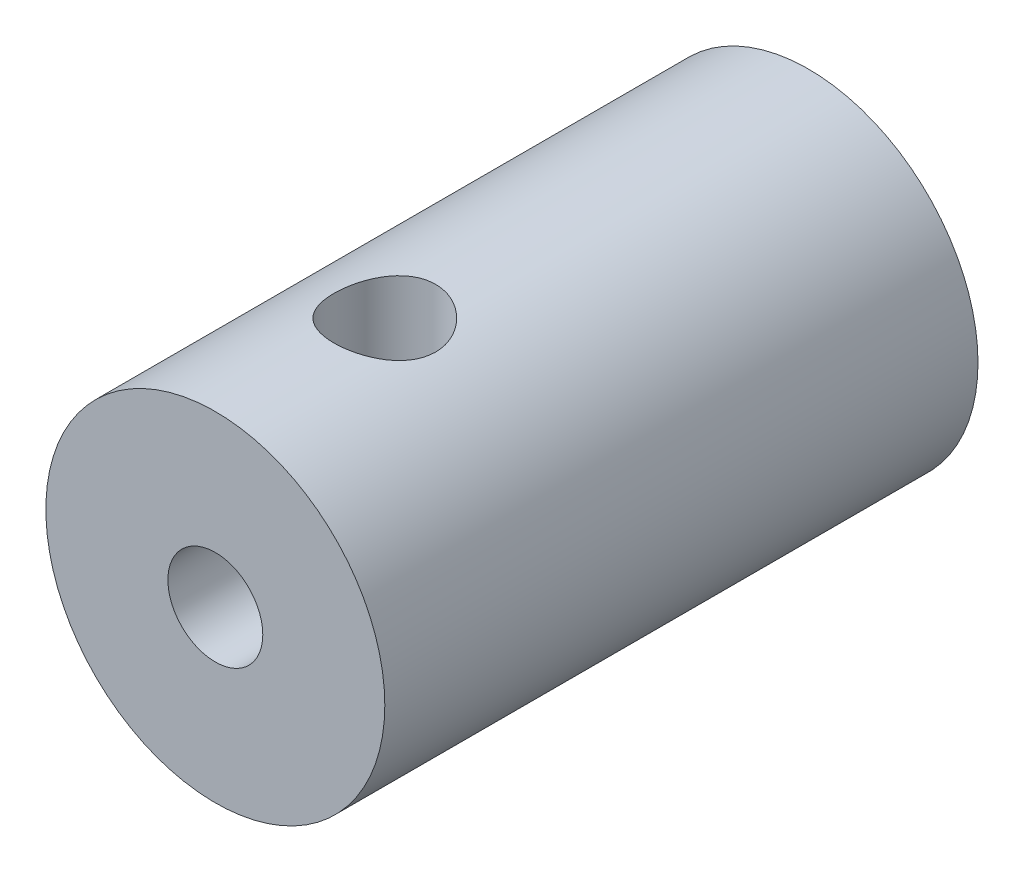
ISO-10303-21;
HEADER;
FILE_DESCRIPTION(('STEP AP214'),'2;1');
FILE_NAME('part.step','',(''),(''),'','','');
FILE_SCHEMA(('AUTOMOTIVE_DESIGN { 1 0 10303 214 1 1 1 1 }'));
ENDSEC;
DATA;
#1=APPLICATION_CONTEXT('core data for automotive mechanical design processes');
#2=APPLICATION_PROTOCOL_DEFINITION('international standard','automotive_design',2000,#1);
#3=PRODUCT_CONTEXT('',#1,'mechanical');
#4=PRODUCT('Part','Part','',(#3));
#5=PRODUCT_RELATED_PRODUCT_CATEGORY('part','',(#4));
#6=PRODUCT_DEFINITION_FORMATION('','',#4);
#7=PRODUCT_DEFINITION_CONTEXT('part definition',#1,'design');
#8=PRODUCT_DEFINITION('design','',#6,#7);
#9=PRODUCT_DEFINITION_SHAPE('','',#8);
#10=(LENGTH_UNIT() NAMED_UNIT(*) SI_UNIT(.MILLI.,.METRE.));
#11=(NAMED_UNIT(*) PLANE_ANGLE_UNIT() SI_UNIT($,.RADIAN.));
#12=(NAMED_UNIT(*) SI_UNIT($,.STERADIAN.) SOLID_ANGLE_UNIT());
#13=UNCERTAINTY_MEASURE_WITH_UNIT(LENGTH_MEASURE(1.E-05),#10,'distance_accuracy_value','');
#14=(GEOMETRIC_REPRESENTATION_CONTEXT(3) GLOBAL_UNCERTAINTY_ASSIGNED_CONTEXT((#13)) GLOBAL_UNIT_ASSIGNED_CONTEXT((#10,
#11,#12)) REPRESENTATION_CONTEXT('',''));
#15=CARTESIAN_POINT('',(0.,0.,0.));
#16=DIRECTION('',(0.,0.,1.));
#17=DIRECTION('',(1.,0.,0.));
#18=AXIS2_PLACEMENT_3D('',#15,#16,#17);
#19=CARTESIAN_POINT('',(0.,0.,35.));
#20=DIRECTION('',(0.,0.,-1.));
#21=DIRECTION('',(-1.,0.,0.));
#22=AXIS2_PLACEMENT_3D('',#19,#20,#21);
#23=CYLINDRICAL_SURFACE('',#22,10.);
#24=CARTESIAN_POINT('',(0.,-10.,28.));
#25=CARTESIAN_POINT('',(0.164577225506603,-9.999998585011,27.9999980050302));
#26=CARTESIAN_POINT('',(0.329174636703062,-9.99589831387907,27.9864122727521));
#27=CARTESIAN_POINT('',(0.653576250609765,-9.97994211187382,27.9325572915558));
#28=CARTESIAN_POINT('',(0.813379008822843,-9.96808386779384,27.8922800839533));
#29=CARTESIAN_POINT('',(1.12346541550906,-9.93791105003673,27.7865079661795));
#30=CARTESIAN_POINT('',(1.27376272879075,-9.91960600500851,27.7210502607621));
#31=CARTESIAN_POINT('',(1.56124836210627,-9.8784421847529,27.5669278138883));
#32=CARTESIAN_POINT('',(1.69843493493934,-9.85558280384133,27.4782599852092));
#33=CARTESIAN_POINT('',(1.95974359436749,-9.80701474385548,27.2775519850547));
#34=CARTESIAN_POINT('',(2.08343614248869,-9.78124767314072,27.1649667482282));
#35=CARTESIAN_POINT('',(2.31049841846648,-9.73011668420884,26.9207815401796));
#36=CARTESIAN_POINT('',(2.41386472654882,-9.70475283449003,26.7891783757501));
#37=CARTESIAN_POINT('',(2.59960075447416,-9.65668227987544,26.5070584939248));
#38=CARTESIAN_POINT('',(2.68144618044427,-9.63404813327749,26.3561830780185));
#39=CARTESIAN_POINT('',(2.81842789549521,-9.59487240788062,26.0420214915394));
#40=CARTESIAN_POINT('',(2.87357059839947,-9.57832936626621,25.8787383121441));
#41=CARTESIAN_POINT('',(2.95403267365304,-9.55381741676868,25.5492194677391));
#42=CARTESIAN_POINT('',(2.98014392469355,-9.54562138649066,25.3831945122721));
#43=CARTESIAN_POINT('',(3.00427461229344,-9.53805579499534,25.0489336875665));
#44=CARTESIAN_POINT('',(3.00230085522157,-9.53868409521142,24.8806983638818));
#45=CARTESIAN_POINT('',(2.97093954399624,-9.54849488135555,24.553232182783));
#46=CARTESIAN_POINT('',(2.94254410525371,-9.55736777198281,24.3938954992755));
#47=CARTESIAN_POINT('',(2.86074840854112,-9.58216712457248,24.0823604274531));
#48=CARTESIAN_POINT('',(2.80734568283282,-9.59809428264701,23.9301627452513));
#49=CARTESIAN_POINT('',(2.67632053307364,-9.63545466149946,23.6347993006785));
#50=CARTESIAN_POINT('',(2.59837633869285,-9.65696032231904,23.4917858320895));
#51=CARTESIAN_POINT('',(2.42070445177367,-9.70301974000129,23.2205359559796));
#52=CARTESIAN_POINT('',(2.32097148005177,-9.72757423493982,23.0923031411724));
#53=CARTESIAN_POINT('',(2.09762581531093,-9.77822022595874,22.848627618476));
#54=CARTESIAN_POINT('',(1.97318981493395,-9.80433308620996,22.7339426719407));
#55=CARTESIAN_POINT('',(1.70652651862794,-9.85424488126517,22.5268920318715));
#56=CARTESIAN_POINT('',(1.56429810372178,-9.8780436703682,22.4345277431711));
#57=CARTESIAN_POINT('',(1.26471007668561,-9.92086320138941,22.2742801550705));
#58=CARTESIAN_POINT('',(1.1072554994959,-9.93985087336628,22.2065649675003));
#59=CARTESIAN_POINT('',(0.782490831207043,-9.97067043664444,22.0988008198007));
#60=CARTESIAN_POINT('',(0.615183503179168,-9.98250432373999,22.058744142935));
#61=CARTESIAN_POINT('',(0.281904485336668,-9.99736729287077,22.0086956442012));
#62=CARTESIAN_POINT('',(0.116100195202379,-10.0006970083558,21.9976768283968));
#63=CARTESIAN_POINT('',(-0.214999211646762,-9.99905846483519,22.0031383114242));
#64=CARTESIAN_POINT('',(-0.380294393381558,-9.99409131355514,22.0196149393029));
#65=CARTESIAN_POINT('',(-0.70180721061939,-9.97661393974325,22.078769222223));
#66=CARTESIAN_POINT('',(-0.858145545228334,-9.96427659598829,22.1208467751617));
#67=CARTESIAN_POINT('',(-1.16150927790904,-9.9334869568307,22.2292864655564));
#68=CARTESIAN_POINT('',(-1.30853355405116,-9.91503392642188,22.2956515220757));
#69=CARTESIAN_POINT('',(-1.5928743789221,-9.87339308702631,22.4525063309623));
#70=CARTESIAN_POINT('',(-1.72988765239933,-9.8501056165928,22.543518681896));
#71=CARTESIAN_POINT('',(-1.98704661596029,-9.80146937528705,22.7464495081056));
#72=CARTESIAN_POINT('',(-2.10718806471188,-9.7761200886242,22.8583732237753));
#73=CARTESIAN_POINT('',(-2.33171489102052,-9.72506343738007,23.1047746167387));
#74=CARTESIAN_POINT('',(-2.43536962463001,-9.69937650065513,23.2399237515437));
#75=CARTESIAN_POINT('',(-2.61857990144312,-9.65153030477949,23.5262558780269));
#76=CARTESIAN_POINT('',(-2.69813607658965,-9.62937095313121,23.6774384491158));
#77=CARTESIAN_POINT('',(-2.83034694254315,-9.5913437922631,23.99106498251));
#78=CARTESIAN_POINT('',(-2.88312693874021,-9.57544675673501,24.1534523730757));
#79=CARTESIAN_POINT('',(-2.96043461630306,-9.55183188739737,24.4853759378605));
#80=CARTESIAN_POINT('',(-2.98497197957848,-9.54411125069387,24.6549096415661));
#81=CARTESIAN_POINT('',(-3.0044396896993,-9.53799944941558,24.9887230367768));
#82=CARTESIAN_POINT('',(-3.00056110615886,-9.53923294700395,25.1529273020988));
#83=CARTESIAN_POINT('',(-2.9661501088861,-9.54998802392189,25.4782282068012));
#84=CARTESIAN_POINT('',(-2.93561876249407,-9.55950927135902,25.639324970361));
#85=CARTESIAN_POINT('',(-2.84953777608685,-9.58551527389243,25.9518907982634));
#86=CARTESIAN_POINT('',(-2.79430351014247,-9.60191209104934,26.1034545747174));
#87=CARTESIAN_POINT('',(-2.66063014242147,-9.63980557805266,26.3952848776415));
#88=CARTESIAN_POINT('',(-2.58218659925722,-9.6613032238508,26.5355492352832));
#89=CARTESIAN_POINT('',(-2.40097527610175,-9.70795352855338,26.8063262330525));
#90=CARTESIAN_POINT('',(-2.29742552185995,-9.7332108032858,26.9362975225204));
#91=CARTESIAN_POINT('',(-2.07034869259555,-9.78402640899066,27.1774049966162));
#92=CARTESIAN_POINT('',(-1.94681643426897,-9.80958481647543,27.2885362789356));
#93=CARTESIAN_POINT('',(-1.67893152436651,-9.85901873141573,27.4920468245899));
#94=CARTESIAN_POINT('',(-1.53407577158121,-9.88282319531422,27.5837828937109));
#95=CARTESIAN_POINT('',(-1.23028274796705,-9.92521360911553,27.7414703398081));
#96=CARTESIAN_POINT('',(-1.0713521059979,-9.94380199862114,27.807433776549));
#97=CARTESIAN_POINT('',(-0.761515425310559,-9.97204349938619,27.9057905513055));
#98=CARTESIAN_POINT('',(-0.611573923908463,-9.9824405476214,27.9410233457665));
#99=CARTESIAN_POINT('',(-0.307760390461553,-9.9964188898898,27.9881270504832));
#100=CARTESIAN_POINT('',(-0.153889019716275,-10.0000013230948,28.0000018654096));
#101=CARTESIAN_POINT('',(0.,-10.,28.));
#102=B_SPLINE_CURVE_WITH_KNOTS('',3,(#24,#25,#26,#27,#28,#29,#30,#31,#32,#33,#34,#35,#36,#37,
#38,#39,#40,#41,#42,#43,#44,#45,#46,#47,#48,#49,#50,#51,#52,#53,#54,#55,#56,#57,#58,#59,#60,#61,
#62,#63,#64,#65,#66,#67,#68,#69,#70,#71,#72,#73,#74,#75,#76,#77,#78,#79,#80,#81,#82,#83,#84,#85,
#86,#87,#88,#89,#90,#91,#92,#93,#94,#95,#96,#97,#98,#99,#100,#101),.UNSPECIFIED.,.T.,.F.,(4,2,2,
2,2,2,2,2,2,2,2,2,2,2,2,2,2,2,2,2,2,2,2,2,2,2,2,2,2,2,2,2,2,2,2,2,2,2,4),(0.,0.493166407225221,
0.986479929691998,1.47906735260175,1.9717203288254,2.47711205896383,2.98258874577266,
3.49942962008218,4.01614629086447,4.51839378713197,5.02051956638178,5.50452033395352,
5.98856887316002,6.47924852894239,6.97004720317111,7.48134208096333,7.99266913062143,
8.50742093763377,9.02202907057615,9.5181761887709,10.0142570710065,10.4991349336465,
10.9840710918746,11.4802261140582,11.9765056400038,12.4908080064564,13.0050968850536,
13.516956299025,14.0286401892057,14.5190031093854,15.0093463933232,15.4936008081456,
15.9779479511534,16.4799385136898,16.9820594980413,17.4988599232246,18.0154182319959,
18.4766338387004,18.9377723390687),.UNSPECIFIED.);
#103=CARTESIAN_POINT('',(0.,-10.,28.));
#104=VERTEX_POINT('',#103);
#105=EDGE_CURVE('E10',#104,#104,#102,.T.);
#106=ORIENTED_EDGE('',*,*,#105,.T.);
#107=EDGE_LOOP('',(#106));
#108=FACE_BOUND('',#107,.T.);
#109=CARTESIAN_POINT('',(0.,10.,28.));
#110=CARTESIAN_POINT('',(-0.1645772255066,9.999998585011,27.9999980050302));
#111=CARTESIAN_POINT('',(-0.329174636703059,9.99589831387907,27.9864122727521));
#112=CARTESIAN_POINT('',(-0.653576250609762,9.97994211187382,27.9325572915558));
#113=CARTESIAN_POINT('',(-0.81337900882284,9.96808386779384,27.8922800839533));
#114=CARTESIAN_POINT('',(-1.12346541550905,9.93791105003673,27.7865079661795));
#115=CARTESIAN_POINT('',(-1.27376272879074,9.91960600500851,27.7210502607621));
#116=CARTESIAN_POINT('',(-1.56124836210626,9.87844218475291,27.5669278138883));
#117=CARTESIAN_POINT('',(-1.69843493493934,9.85558280384133,27.4782599852092));
#118=CARTESIAN_POINT('',(-1.95974359436749,9.80701474385548,27.2775519850547));
#119=CARTESIAN_POINT('',(-2.08343614248868,9.78124767314073,27.1649667482282));
#120=CARTESIAN_POINT('',(-2.31049841846647,9.73011668420884,26.9207815401796));
#121=CARTESIAN_POINT('',(-2.41386472654881,9.70475283449003,26.7891783757501));
#122=CARTESIAN_POINT('',(-2.59960075447415,9.65668227987544,26.5070584939248));
#123=CARTESIAN_POINT('',(-2.68144618044427,9.63404813327749,26.3561830780185));
#124=CARTESIAN_POINT('',(-2.8184278954952,9.59487240788062,26.0420214915394));
#125=CARTESIAN_POINT('',(-2.87357059839946,9.57832936626621,25.878738312144));
#126=CARTESIAN_POINT('',(-2.95403267365303,9.55381741676869,25.5492194677391));
#127=CARTESIAN_POINT('',(-2.98014392469354,9.54562138649067,25.3831945122721));
#128=CARTESIAN_POINT('',(-3.00427461229344,9.53805579499535,25.0489336875665));
#129=CARTESIAN_POINT('',(-3.00230085522156,9.53868409521142,24.8806983638818));
#130=CARTESIAN_POINT('',(-2.97093954399623,9.54849488135556,24.553232182783));
#131=CARTESIAN_POINT('',(-2.9425441052537,9.55736777198281,24.3938954992755));
#132=CARTESIAN_POINT('',(-2.86074840854111,9.58216712457249,24.0823604274531));
#133=CARTESIAN_POINT('',(-2.80734568283281,9.59809428264701,23.9301627452513));
#134=CARTESIAN_POINT('',(-2.67632053307363,9.63545466149946,23.6347993006785));
#135=CARTESIAN_POINT('',(-2.59837633869284,9.65696032231904,23.4917858320895));
#136=CARTESIAN_POINT('',(-2.42070445177366,9.70301974000129,23.2205359559796));
#137=CARTESIAN_POINT('',(-2.32097148005176,9.72757423493982,23.0923031411724));
#138=CARTESIAN_POINT('',(-2.09762581531092,9.77822022595875,22.848627618476));
#139=CARTESIAN_POINT('',(-1.97318981493394,9.80433308620996,22.7339426719407));
#140=CARTESIAN_POINT('',(-1.70652651862793,9.85424488126517,22.5268920318715));
#141=CARTESIAN_POINT('',(-1.56429810372177,9.8780436703682,22.4345277431711));
#142=CARTESIAN_POINT('',(-1.2647100766856,9.92086320138941,22.2742801550705));
#143=CARTESIAN_POINT('',(-1.10725549949589,9.93985087336628,22.2065649675003));
#144=CARTESIAN_POINT('',(-0.782490831207032,9.97067043664444,22.0988008198007));
#145=CARTESIAN_POINT('',(-0.615183503179156,9.98250432373999,22.058744142935));
#146=CARTESIAN_POINT('',(-0.281904485336656,9.99736729287077,22.0086956442012));
#147=CARTESIAN_POINT('',(-0.116100195202367,10.0006970083558,21.9976768283968));
#148=CARTESIAN_POINT('',(0.214999211646774,9.99905846483519,22.0031383114242));
#149=CARTESIAN_POINT('',(0.38029439338157,9.99409131355514,22.0196149393029));
#150=CARTESIAN_POINT('',(0.701807210619402,9.97661393974325,22.078769222223));
#151=CARTESIAN_POINT('',(0.858145545228346,9.96427659598829,22.1208467751617));
#152=CARTESIAN_POINT('',(1.16150927790905,9.9334869568307,22.2292864655564));
#153=CARTESIAN_POINT('',(1.30853355405118,9.91503392642188,22.2956515220757));
#154=CARTESIAN_POINT('',(1.59287437892211,9.87339308702631,22.4525063309623));
#155=CARTESIAN_POINT('',(1.72988765239934,9.8501056165928,22.543518681896));
#156=CARTESIAN_POINT('',(1.9870466159603,9.80146937528704,22.7464495081056));
#157=CARTESIAN_POINT('',(2.10718806471189,9.7761200886242,22.8583732237753));
#158=CARTESIAN_POINT('',(2.33171489102053,9.72506343738007,23.1047746167387));
#159=CARTESIAN_POINT('',(2.43536962463002,9.69937650065513,23.2399237515437));
#160=CARTESIAN_POINT('',(2.61857990144314,9.65153030477949,23.5262558780269));
#161=CARTESIAN_POINT('',(2.69813607658966,9.62937095313121,23.6774384491158));
#162=CARTESIAN_POINT('',(2.83034694254316,9.59134379226309,23.99106498251));
#163=CARTESIAN_POINT('',(2.88312693874022,9.575446756735,24.1534523730757));
#164=CARTESIAN_POINT('',(2.96043461630307,9.55183188739737,24.4853759378605));
#165=CARTESIAN_POINT('',(2.98497197957849,9.54411125069387,24.6549096415661));
#166=CARTESIAN_POINT('',(3.0044396896993,9.53799944941558,24.9887230367768));
#167=CARTESIAN_POINT('',(3.00056110615887,9.53923294700394,25.1529273020988));
#168=CARTESIAN_POINT('',(2.96615010888611,9.54998802392188,25.4782282068012));
#169=CARTESIAN_POINT('',(2.93561876249408,9.55950927135902,25.639324970361));
#170=CARTESIAN_POINT('',(2.84953777608686,9.58551527389243,25.9518907982634));
#171=CARTESIAN_POINT('',(2.79430351014248,9.60191209104934,26.1034545747174));
#172=CARTESIAN_POINT('',(2.66063014242147,9.63980557805265,26.3952848776415));
#173=CARTESIAN_POINT('',(2.58218659925722,9.6613032238508,26.5355492352832));
#174=CARTESIAN_POINT('',(2.40097527610175,9.70795352855338,26.8063262330525));
#175=CARTESIAN_POINT('',(2.29742552185996,9.7332108032858,26.9362975225204));
#176=CARTESIAN_POINT('',(2.07034869259555,9.78402640899066,27.1774049966162));
#177=CARTESIAN_POINT('',(1.94681643426898,9.80958481647543,27.2885362789356));
#178=CARTESIAN_POINT('',(1.67893152436652,9.85901873141573,27.4920468245899));
#179=CARTESIAN_POINT('',(1.53407577158122,9.88282319531422,27.5837828937109));
#180=CARTESIAN_POINT('',(1.23028274796705,9.92521360911553,27.7414703398081));
#181=CARTESIAN_POINT('',(1.07135210599791,9.94380199862114,27.807433776549));
#182=CARTESIAN_POINT('',(0.761515425310562,9.97204349938619,27.9057905513055));
#183=CARTESIAN_POINT('',(0.611573923908466,9.9824405476214,27.9410233457665));
#184=CARTESIAN_POINT('',(0.307760390461557,9.9964188898898,27.9881270504832));
#185=CARTESIAN_POINT('',(0.153889019716278,10.0000013230948,28.0000018654096));
#186=CARTESIAN_POINT('',(0.,10.,28.));
#187=B_SPLINE_CURVE_WITH_KNOTS('',3,(#109,#110,#111,#112,#113,#114,#115,#116,#117,#118,#119,
#120,#121,#122,#123,#124,#125,#126,#127,#128,#129,#130,#131,#132,#133,#134,#135,#136,#137,#138,
#139,#140,#141,#142,#143,#144,#145,#146,#147,#148,#149,#150,#151,#152,#153,#154,#155,#156,#157,
#158,#159,#160,#161,#162,#163,#164,#165,#166,#167,#168,#169,#170,#171,#172,#173,#174,#175,#176,
#177,#178,#179,#180,#181,#182,#183,#184,#185,#186),.UNSPECIFIED.,.T.,.F.,(4,2,2,2,2,2,2,2,2,2,2,
2,2,2,2,2,2,2,2,2,2,2,2,2,2,2,2,2,2,2,2,2,2,2,2,2,2,2,4),(0.,0.493166407225221,
0.986479929691999,1.47906735260175,1.9717203288254,2.47711205896383,2.98258874577266,
3.49942962008218,4.01614629086447,4.51839378713198,5.02051956638179,5.50452033395352,
5.98856887316002,6.47924852894239,6.97004720317111,7.48134208096333,7.99266913062143,
8.50742093763377,9.02202907057615,9.5181761887709,10.0142570710065,10.4991349336465,
10.9840710918746,11.4802261140582,11.9765056400038,12.4908080064564,13.0050968850536,
13.516956299025,14.0286401892057,14.5190031093854,15.0093463933232,15.4936008081456,
15.9779479511534,16.4799385136898,16.9820594980412,17.4988599232246,18.0154182319959,
18.4766338387004,18.9377723390687),.UNSPECIFIED.);
#188=CARTESIAN_POINT('',(0.,10.,28.));
#189=VERTEX_POINT('',#188);
#190=EDGE_CURVE('E42',#189,#189,#187,.T.);
#191=ORIENTED_EDGE('',*,*,#190,.T.);
#192=EDGE_LOOP('',(#191));
#193=FACE_BOUND('',#192,.T.);
#194=CARTESIAN_POINT('',(0.,0.,35.));
#195=DIRECTION('',(0.,0.,1.));
#196=DIRECTION('',(1.,0.,0.));
#197=AXIS2_PLACEMENT_3D('',#194,#195,#196);
#198=CIRCLE('',#197,10.);
#199=CARTESIAN_POINT('',(10.,0.,35.));
#200=VERTEX_POINT('',#199);
#201=EDGE_CURVE('E46',#200,#200,#198,.T.);
#202=ORIENTED_EDGE('',*,*,#201,.F.);
#203=EDGE_LOOP('',(#202));
#204=FACE_BOUND('',#203,.T.);
#205=CARTESIAN_POINT('',(0.,0.,0.));
#206=DIRECTION('',(0.,0.,1.));
#207=DIRECTION('',(1.,0.,0.));
#208=AXIS2_PLACEMENT_3D('',#205,#206,#207);
#209=CIRCLE('',#208,10.);
#210=CARTESIAN_POINT('',(10.,0.,0.));
#211=VERTEX_POINT('',#210);
#212=EDGE_CURVE('E50',#211,#211,#209,.T.);
#213=ORIENTED_EDGE('',*,*,#212,.T.);
#214=EDGE_LOOP('',(#213));
#215=FACE_BOUND('',#214,.T.);
#216=ADVANCED_FACE('F31',(#108,#193,#204,#215),#23,.T.);
#217=CARTESIAN_POINT('',(0.,0.,35.));
#218=DIRECTION('',(0.,0.,1.));
#219=DIRECTION('',(1.,0.,0.));
#220=AXIS2_PLACEMENT_3D('',#217,#218,#219);
#221=PLANE('',#220);
#222=CARTESIAN_POINT('',(0.,0.,35.));
#223=DIRECTION('',(0.,0.,1.));
#224=DIRECTION('',(1.,0.,0.));
#225=AXIS2_PLACEMENT_3D('',#222,#223,#224);
#226=CIRCLE('',#225,2.8);
#227=CARTESIAN_POINT('',(2.8,0.,35.));
#228=VERTEX_POINT('',#227);
#229=EDGE_CURVE('E105',#228,#228,#226,.T.);
#230=ORIENTED_EDGE('',*,*,#229,.F.);
#231=EDGE_LOOP('',(#230));
#232=FACE_BOUND('',#231,.T.);
#233=ORIENTED_EDGE('',*,*,#201,.T.);
#234=EDGE_LOOP('',(#233));
#235=FACE_BOUND('',#234,.T.);
#236=ADVANCED_FACE('F75',(#232,#235),#221,.T.);
#237=CARTESIAN_POINT('',(0.,0.,0.));
#238=DIRECTION('',(0.,0.,1.));
#239=DIRECTION('',(1.,0.,0.));
#240=AXIS2_PLACEMENT_3D('',#237,#238,#239);
#241=PLANE('',#240);
#242=CARTESIAN_POINT('',(0.,0.,0.));
#243=DIRECTION('',(0.,0.,1.));
#244=DIRECTION('',(1.,0.,0.));
#245=AXIS2_PLACEMENT_3D('',#242,#243,#244);
#246=CIRCLE('',#245,3.10946077913861);
#247=CARTESIAN_POINT('',(3.10946077913861,0.,0.));
#248=VERTEX_POINT('',#247);
#249=EDGE_CURVE('E92',#248,#248,#246,.T.);
#250=ORIENTED_EDGE('',*,*,#249,.T.);
#251=EDGE_LOOP('',(#250));
#252=FACE_BOUND('',#251,.T.);
#253=ORIENTED_EDGE('',*,*,#212,.F.);
#254=EDGE_LOOP('',(#253));
#255=FACE_BOUND('',#254,.T.);
#256=ADVANCED_FACE('F70',(#252,#255),#241,.F.);
#257=CARTESIAN_POINT('',(0.,0.,12.));
#258=DIRECTION('',(0.,0.,-1.));
#259=DIRECTION('',(-1.,0.,0.));
#260=AXIS2_PLACEMENT_3D('',#257,#258,#259);
#261=PLANE('',#260);
#262=CARTESIAN_POINT('',(0.,0.,12.));
#263=DIRECTION('',(0.,0.,-1.));
#264=DIRECTION('',(-1.,0.,0.));
#265=AXIS2_PLACEMENT_3D('',#262,#263,#264);
#266=CIRCLE('',#265,2.9);
#267=CARTESIAN_POINT('',(-2.9,0.,12.));
#268=VERTEX_POINT('',#267);
#269=EDGE_CURVE('E93',#268,#268,#266,.T.);
#270=ORIENTED_EDGE('',*,*,#269,.T.);
#271=EDGE_LOOP('',(#270));
#272=FACE_BOUND('',#271,.T.);
#273=ADVANCED_FACE('F66',(#272),#261,.T.);
#274=CARTESIAN_POINT('',(0.,0.,12.));
#275=DIRECTION('',(0.,0.,-1.));
#276=DIRECTION('',(-1.,0.,0.));
#277=AXIS2_PLACEMENT_3D('',#274,#275,#276);
#278=CONICAL_SURFACE('',#277,2.9,0.0174532925199433);
#279=ORIENTED_EDGE('',*,*,#249,.F.);
#280=EDGE_LOOP('',(#279));
#281=FACE_BOUND('',#280,.T.);
#282=ORIENTED_EDGE('',*,*,#269,.F.);
#283=EDGE_LOOP('',(#282));
#284=FACE_BOUND('',#283,.T.);
#285=ADVANCED_FACE('F62',(#281,#284),#278,.F.);
#286=CARTESIAN_POINT('',(0.,-10.,25.));
#287=DIRECTION('',(0.,1.,0.));
#288=DIRECTION('',(0.,0.,1.));
#289=AXIS2_PLACEMENT_3D('',#286,#287,#288);
#290=CYLINDRICAL_SURFACE('',#289,3.);
#291=CARTESIAN_POINT('',(2.8,0.,26.0770329614269));
#292=CARTESIAN_POINT('',(2.79999498074129,-0.0744014223756094,26.0770546125621));
#293=CARTESIAN_POINT('',(2.79697802260037,-0.148965234791994,26.0849881528792));
#294=CARTESIAN_POINT('',(2.78539087412235,-0.295059995605467,26.1143656316886));
#295=CARTESIAN_POINT('',(2.77678821259974,-0.366570587669669,26.1358885485488));
#296=CARTESIAN_POINT('',(2.75741436267209,-0.489499389512896,26.1820076246524));
#297=CARTESIAN_POINT('',(2.74758142372162,-0.54178817509307,26.2047913778353));
#298=CARTESIAN_POINT('',(2.72542591327978,-0.64404093915216,26.2541089273344));
#299=CARTESIAN_POINT('',(2.71310126640349,-0.694002936646388,26.2806458441503));
#300=CARTESIAN_POINT('',(2.67263878065364,-0.84106786082365,26.3641088148703));
#301=CARTESIAN_POINT('',(2.64105690563807,-0.935084433773691,26.4247729500025));
#302=CARTESIAN_POINT('',(2.5705568031351,-1.11408437164229,26.5482867734923));
#303=CARTESIAN_POINT('',(2.53188658067288,-1.19925393043542,26.6110166187618));
#304=CARTESIAN_POINT('',(2.4466712725348,-1.36471987946554,26.7377087663457));
#305=CARTESIAN_POINT('',(2.40012010874351,-1.44501244291615,26.8016719858935));
#306=CARTESIAN_POINT('',(2.29911207727476,-1.60083996476972,26.9289066358263));
#307=CARTESIAN_POINT('',(2.24466537120974,-1.67638086209148,26.9921788446682));
#308=CARTESIAN_POINT('',(2.12765464853198,-1.82259293771147,27.1166917596476));
#309=CARTESIAN_POINT('',(2.06509536056354,-1.89326691637246,27.1779336233196));
#310=CARTESIAN_POINT('',(1.89995176614757,-2.0615332996638,27.325420355521));
#311=CARTESIAN_POINT('',(1.79243523901415,-2.15603945162211,27.4097844165251));
#312=CARTESIAN_POINT('',(1.55886581042447,-2.3304716103251,27.5670400167788));
#313=CARTESIAN_POINT('',(1.43284586626629,-2.41042298556093,27.63995148648));
#314=CARTESIAN_POINT('',(1.19088628276601,-2.53700261280471,27.7560640944494));
#315=CARTESIAN_POINT('',(1.07823420224952,-2.58710274877496,27.8022913505498));
#316=CARTESIAN_POINT('',(0.843204792960198,-2.67294213956903,27.8817276701544));
#317=CARTESIAN_POINT('',(0.720833186944042,-2.70868977101226,27.9149443268183));
#318=CARTESIAN_POINT('',(0.468291914561453,-2.76360243943751,27.9660404566317));
#319=CARTESIAN_POINT('',(0.338073017391066,-2.7826478439643,27.9838092743775));
#320=CARTESIAN_POINT('',(0.0750603648880546,-2.80209215376795,28.0019505641029));
#321=CARTESIAN_POINT('',(-0.0577319783431796,-2.80250101080627,28.0023323206286));
#322=CARTESIAN_POINT('',(-0.305729710384691,-2.78571118776224,27.986667171504));
#323=CARTESIAN_POINT('',(-0.421203252267984,-2.77052948705824,27.972502199087));
#324=CARTESIAN_POINT('',(-0.647202330397019,-2.72660699593194,27.9316073453631));
#325=CARTESIAN_POINT('',(-0.757727151377735,-2.69786425234202,27.9048756541011));
#326=CARTESIAN_POINT('',(-0.975203431918478,-2.62726177617658,27.8394229973032));
#327=CARTESIAN_POINT('',(-1.08190359737359,-2.584987250689,27.8003234376691));
#328=CARTESIAN_POINT('',(-1.28613553134147,-2.48969408969603,27.7126059746767));
#329=CARTESIAN_POINT('',(-1.3836628878344,-2.4366703222226,27.6639835252201));
#330=CARTESIAN_POINT('',(-1.61732303726774,-2.29168316060278,27.531896120168));
#331=CARTESIAN_POINT('',(-1.74702668973524,-2.19384310686512,27.4434938616616));
#332=CARTESIAN_POINT('',(-1.98381576775268,-1.98237709673951,27.2555288940671));
#333=CARTESIAN_POINT('',(-2.09083589292551,-1.86870708547909,27.1559351938854));
#334=CARTESIAN_POINT('',(-2.23604941836921,-1.6870916946704,27.0013140298157));
#335=CARTESIAN_POINT('',(-2.28238135995438,-1.62383415099571,26.9482007075911));
#336=CARTESIAN_POINT('',(-2.36939276049989,-1.49401727798893,26.841389974739));
#337=CARTESIAN_POINT('',(-2.41007352637469,-1.42745871691183,26.7876927022659));
#338=CARTESIAN_POINT('',(-2.48579447863169,-1.29108436581462,26.6808050273277));
#339=CARTESIAN_POINT('',(-2.52084589574095,-1.22127542875345,26.6276138199458));
#340=CARTESIAN_POINT('',(-2.58539569629364,-1.07791938659313,26.5229887920152));
#341=CARTESIAN_POINT('',(-2.6148976894877,-1.00437475128771,26.4715538470135));
#342=CARTESIAN_POINT('',(-2.66485594555822,-0.862254096700601,26.3787533643272));
#343=CARTESIAN_POINT('',(-2.68598292590387,-0.794214033168738,26.3369344760402));
#344=CARTESIAN_POINT('',(-2.72357349175099,-0.653784366472763,26.2585807636871));
#345=CARTESIAN_POINT('',(-2.74003603489763,-0.581393795481198,26.2220471215983));
#346=CARTESIAN_POINT('',(-2.76527237673505,-0.444153836397234,26.1636624908579));
#347=CARTESIAN_POINT('',(-2.77487458804731,-0.380091201823928,26.1403744511009));
#348=CARTESIAN_POINT('',(-2.78969868969402,-0.248816139710207,26.1036229143903));
#349=CARTESIAN_POINT('',(-2.79493735608336,-0.181616834260083,26.0901218168562));
#350=CARTESIAN_POINT('',(-2.80048635437606,-0.0447315714908857,26.0758038385783));
#351=CARTESIAN_POINT('',(-2.80073570051437,0.0249747344809824,26.0751439216181));
#352=CARTESIAN_POINT('',(-2.79610490004121,0.163108775113623,26.0871176795257));
#353=CARTESIAN_POINT('',(-2.79121353091315,0.231533379171846,26.0997804387298));
#354=CARTESIAN_POINT('',(-2.77495759234439,0.383359295298423,26.1402540435566));
#355=CARTESIAN_POINT('',(-2.76218215076992,0.46570068449684,26.1712744018253));
#356=CARTESIAN_POINT('',(-2.73060436832138,0.62484807735486,26.2431191610729));
#357=CARTESIAN_POINT('',(-2.71177586306073,0.701628244025038,26.2839859274374));
#358=CARTESIAN_POINT('',(-2.66726672549227,0.855911895795408,26.3741928303506));
#359=CARTESIAN_POINT('',(-2.64118629273598,0.933059194676543,26.4239337025425));
#360=CARTESIAN_POINT('',(-2.58328374948061,1.08310368951003,26.5264752189075));
#361=CARTESIAN_POINT('',(-2.55145593199125,1.15599656487485,26.5792788686334));
#362=CARTESIAN_POINT('',(-2.48212238409996,1.29820174237615,26.6861597467006));
#363=CARTESIAN_POINT('',(-2.44460983818601,1.36750961077229,26.740238437092));
#364=CARTESIAN_POINT('',(-2.36389498840745,1.50273103060361,26.8483938016593));
#365=CARTESIAN_POINT('',(-2.32069227201579,1.56864433545668,26.9024704754043));
#366=CARTESIAN_POINT('',(-2.22355322891796,1.70395442673949,27.0154229033061));
#367=CARTESIAN_POINT('',(-2.16896359769067,1.77297327630102,27.0741955663888));
#368=CARTESIAN_POINT('',(-2.05251588706735,1.90657981736412,27.1895013008952));
#369=CARTESIAN_POINT('',(-1.99065559435022,1.97116615000063,27.2460336832974));
#370=CARTESIAN_POINT('',(-1.79416544349892,2.15716529653267,27.4103866432785));
#371=CARTESIAN_POINT('',(-1.64818771429552,2.27144279188087,27.5134962190195));
#372=CARTESIAN_POINT('',(-1.38332025252078,2.43752838787612,27.664742459272));
#373=CARTESIAN_POINT('',(-1.27300493534251,2.4971610032036,27.7194487342068));
#374=CARTESIAN_POINT('',(-1.04067461297274,2.60253379600688,27.8165143310315));
#375=CARTESIAN_POINT('',(-0.918666811792942,2.64828245622097,27.8588811913448));
#376=CARTESIAN_POINT('',(-0.728277506802459,2.70445419974026,27.9110180388086));
#377=CARTESIAN_POINT('',(-0.663238027463046,2.72115505292573,27.9265436400105));
#378=CARTESIAN_POINT('',(-0.531304065812057,2.7499571920587,27.9533431954623));
#379=CARTESIAN_POINT('',(-0.464410577536476,2.76206089349531,27.9646193824646));
#380=CARTESIAN_POINT('',(-0.32934787622425,2.78139899446369,27.9826444869038));
#381=CARTESIAN_POINT('',(-0.261179267838479,2.78863564461799,27.9893954968688));
#382=CARTESIAN_POINT('',(-0.124217581193834,2.79808694258305,27.9982141485762));
#383=CARTESIAN_POINT('',(-0.055424589058045,2.80030227273963,28.0002824266538));
#384=CARTESIAN_POINT('',(0.132799317732547,2.79938791165728,27.9994281875051));
#385=CARTESIAN_POINT('',(0.252255550570252,2.79112776893924,27.9917153533216));
#386=CARTESIAN_POINT('',(0.487386329881521,2.75981178188413,27.9625209451103));
#387=CARTESIAN_POINT('',(0.603060509402475,2.73675450631026,27.9410380391872));
#388=CARTESIAN_POINT('',(0.82652726626546,2.67769657257332,27.8861637310603));
#389=CARTESIAN_POINT('',(0.93439525107276,2.64184798546175,27.8529122767661));
#390=CARTESIAN_POINT('',(1.14190474976563,2.55901524316686,27.7763841553719));
#391=CARTESIAN_POINT('',(1.24154385926675,2.51202784876275,27.7331045721246));
#392=CARTESIAN_POINT('',(1.4763501159385,2.38446351593277,27.6162437790955));
#393=CARTESIAN_POINT('',(1.60624700922535,2.29847140706457,27.5379738049746));
#394=CARTESIAN_POINT('',(1.84583296250838,2.11096671024212,27.3694842259789));
#395=CARTESIAN_POINT('',(1.9554584172731,2.00940704017588,27.2792284862292));
#396=CARTESIAN_POINT('',(2.11970685268089,1.83190737938139,27.1247851327044));
#397=CARTESIAN_POINT('',(2.18012784179467,1.75949107413961,27.0625704209804));
#398=CARTESIAN_POINT('',(2.29286257214669,1.60983478825551,26.9364740588637));
#399=CARTESIAN_POINT('',(2.34517119410984,1.53259180453693,26.8725913853752));
#400=CARTESIAN_POINT('',(2.44175509493079,1.37349434407063,26.7447746063972));
#401=CARTESIAN_POINT('',(2.48604052349377,1.29164586781353,26.6808406701221));
#402=CARTESIAN_POINT('',(2.56670379200162,1.12284680494958,26.5548624889358));
#403=CARTESIAN_POINT('',(2.6030894530782,1.03590137390395,26.492816427771));
#404=CARTESIAN_POINT('',(2.66170668123419,0.872564954701913,26.3850439790598));
#405=CARTESIAN_POINT('',(2.68531298820006,0.79725301682558,26.3384393796829));
#406=CARTESIAN_POINT('',(2.72674906780561,0.641351976050643,26.2518471611792));
#407=CARTESIAN_POINT('',(2.74458759562849,0.560771096813725,26.2118495585574));
#408=CARTESIAN_POINT('',(2.76964721908197,0.415824578588079,26.15316689695));
#409=CARTESIAN_POINT('',(2.7784330743079,0.352914369538524,26.1316429369511));
#410=CARTESIAN_POINT('',(2.79175266065207,0.224174207858849,26.0983863793343));
#411=CARTESIAN_POINT('',(2.7963036854896,0.158357290027448,26.0866139812355));
#412=CARTESIAN_POINT('',(2.79899088409893,0.0767290280401676,26.0796528426954));
#413=CARTESIAN_POINT('',(2.79936857878346,0.0614025234979992,26.0786735298876));
#414=CARTESIAN_POINT('',(2.79987364714112,0.030719652731947,26.0773613740339));
#415=CARTESIAN_POINT('',(2.80000103643609,0.0153632884315265,26.0770284906436));
#416=CARTESIAN_POINT('',(2.8,0.,26.0770329614269));
#417=B_SPLINE_CURVE_WITH_KNOTS('',3,(#291,#292,#293,#294,#295,#296,#297,#298,#299,#300,#301,
#302,#303,#304,#305,#306,#307,#308,#309,#310,#311,#312,#313,#314,#315,#316,#317,#318,#319,#320,
#321,#322,#323,#324,#325,#326,#327,#328,#329,#330,#331,#332,#333,#334,#335,#336,#337,#338,#339,
#340,#341,#342,#343,#344,#345,#346,#347,#348,#349,#350,#351,#352,#353,#354,#355,#356,#357,#358,
#359,#360,#361,#362,#363,#364,#365,#366,#367,#368,#369,#370,#371,#372,#373,#374,#375,#376,#377,
#378,#379,#380,#381,#382,#383,#384,#385,#386,#387,#388,#389,#390,#391,#392,#393,#394,#395,#396,
#397,#398,#399,#400,#401,#402,#403,#404,#405,#406,#407,#408,#409,#410,#411,#412,#413,#414,#415,
#416),.UNSPECIFIED.,.T.,.F.,(4,2,2,2,2,2,2,2,2,2,2,2,2,2,2,2,2,2,2,2,2,2,2,2,2,2,2,2,2,2,2,2,2,
2,2,2,2,2,2,2,2,2,2,2,2,2,2,2,2,2,2,2,2,2,2,2,2,2,2,2,2,2,4),(0.,0.223121074757691,
0.447550967179175,0.620935306295705,0.794464659518409,1.14239140695642,1.47989954873884,
1.81766918689501,2.15500790925139,2.49215088078559,2.98882028049169,3.48461553585531,
3.87808381494808,4.2713221173172,4.66735457442556,5.0631755510145,5.41353317114861,
5.76394126794257,6.12632736868179,6.48888689116815,7.04073995476905,7.594160717611,
7.87809342880366,8.16196036682732,8.4452537510714,8.72836221850678,8.97591601858244,
9.22352509558348,9.42938103749591,9.6344418455536,9.84200765459724,10.0500275364248,
10.3152887375657,10.5817123055275,10.8675803970474,11.153733924204,11.4402332800522,
11.7267534180295,12.0438238182311,12.3609909916307,12.9925659414097,13.4016416342841,
13.8104668869495,14.016971859402,14.223368177003,14.4296689870485,14.6359417612517,
14.9939469251301,15.351986721894,15.7059044685225,16.0599252627284,16.5800806678971,
17.1018414409605,17.4404191833243,17.7792097219143,18.117568635914,18.4555910158657,
18.7302137697133,19.0044176820858,19.2049981981386,19.4047559645583,19.4508315270245,
19.4969042137717),.UNSPECIFIED.);
#418=CARTESIAN_POINT('',(2.8,0.,26.0770329614269));
#419=VERTEX_POINT('',#418);
#420=EDGE_CURVE('E97',#419,#419,#417,.T.);
#421=ORIENTED_EDGE('',*,*,#420,.F.);
#422=EDGE_LOOP('',(#421));
#423=FACE_BOUND('',#422,.T.);
#424=ORIENTED_EDGE('',*,*,#190,.F.);
#425=EDGE_LOOP('',(#424));
#426=FACE_BOUND('',#425,.T.);
#427=ORIENTED_EDGE('',*,*,#105,.F.);
#428=EDGE_LOOP('',(#427));
#429=FACE_BOUND('',#428,.T.);
#430=ADVANCED_FACE('F56',(#423,#426,#429),#290,.F.);
#431=CARTESIAN_POINT('',(0.,0.,-0.001000000000001));
#432=DIRECTION('',(0.,0.,1.));
#433=DIRECTION('',(1.,0.,0.));
#434=AXIS2_PLACEMENT_3D('',#431,#432,#433);
#435=CYLINDRICAL_SURFACE('',#434,2.8);
#436=ORIENTED_EDGE('',*,*,#420,.T.);
#437=EDGE_LOOP('',(#436));
#438=FACE_BOUND('',#437,.T.);
#439=ORIENTED_EDGE('',*,*,#229,.T.);
#440=EDGE_LOOP('',(#439));
#441=FACE_BOUND('',#440,.T.);
#442=ADVANCED_FACE('F61',(#438,#441),#435,.F.);
#443=CLOSED_SHELL('',(#216,#236,#256,#273,#285,#430,#442));
#444=MANIFOLD_SOLID_BREP('B2',#443);
#445=ADVANCED_BREP_SHAPE_REPRESENTATION('',(#18,#444),#14);
#446=SHAPE_DEFINITION_REPRESENTATION(#9,#445);
ENDSEC;
END-ISO-10303-21;
